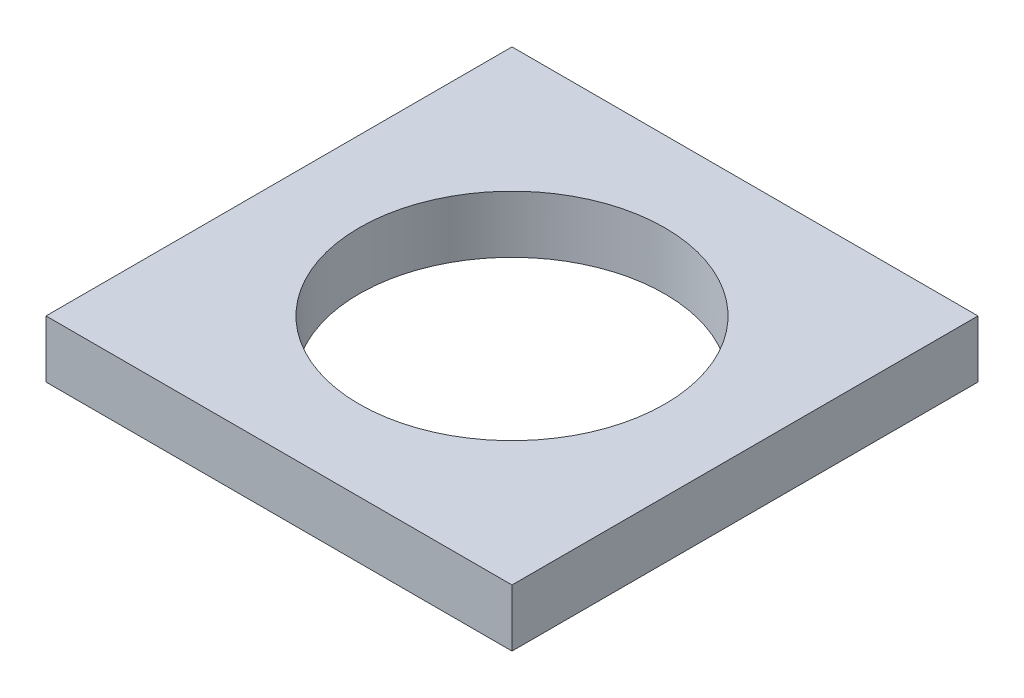
ISO-10303-21;
HEADER;
FILE_DESCRIPTION(('STEP AP214'),'2;1');
FILE_NAME('part.step','',(''),(''),'','','');
FILE_SCHEMA(('AUTOMOTIVE_DESIGN { 1 0 10303 214 1 1 1 1 }'));
ENDSEC;
DATA;
#1=APPLICATION_CONTEXT('core data for automotive mechanical design processes');
#2=APPLICATION_PROTOCOL_DEFINITION('international standard','automotive_design',2000,#1);
#3=PRODUCT_CONTEXT('',#1,'mechanical');
#4=PRODUCT('Part','Part','',(#3));
#5=PRODUCT_RELATED_PRODUCT_CATEGORY('part','',(#4));
#6=PRODUCT_DEFINITION_FORMATION('','',#4);
#7=PRODUCT_DEFINITION_CONTEXT('part definition',#1,'design');
#8=PRODUCT_DEFINITION('design','',#6,#7);
#9=PRODUCT_DEFINITION_SHAPE('','',#8);
#10=(LENGTH_UNIT() NAMED_UNIT(*) SI_UNIT(.MILLI.,.METRE.));
#11=(NAMED_UNIT(*) PLANE_ANGLE_UNIT() SI_UNIT($,.RADIAN.));
#12=(NAMED_UNIT(*) SI_UNIT($,.STERADIAN.) SOLID_ANGLE_UNIT());
#13=UNCERTAINTY_MEASURE_WITH_UNIT(LENGTH_MEASURE(1.E-05),#10,'distance_accuracy_value','');
#14=(GEOMETRIC_REPRESENTATION_CONTEXT(3) GLOBAL_UNCERTAINTY_ASSIGNED_CONTEXT((#13)) GLOBAL_UNIT_ASSIGNED_CONTEXT((#10,
#11,#12)) REPRESENTATION_CONTEXT('',''));
#15=CARTESIAN_POINT('',(0.,0.,0.));
#16=DIRECTION('',(0.,0.,1.));
#17=DIRECTION('',(1.,0.,0.));
#18=AXIS2_PLACEMENT_3D('',#15,#16,#17);
#19=CARTESIAN_POINT('',(-6.1,1.5,-6.1));
#20=DIRECTION('',(1.,0.,0.));
#21=DIRECTION('',(0.,0.,-1.));
#22=AXIS2_PLACEMENT_3D('',#19,#20,#21);
#23=PLANE('',#22);
#24=DIRECTION('',(0.,0.,1.));
#25=VECTOR('',#24,1.);
#26=CARTESIAN_POINT('',(-6.1,0.,-6.1));
#27=LINE('',#26,#25);
#28=CARTESIAN_POINT('',(-6.1,0.,-6.1));
#29=VERTEX_POINT('',#28);
#30=CARTESIAN_POINT('',(-6.1,0.,6.1));
#31=VERTEX_POINT('',#30);
#32=EDGE_CURVE('E112',#29,#31,#27,.T.);
#33=ORIENTED_EDGE('',*,*,#32,.T.);
#34=DIRECTION('',(0.,-1.,0.));
#35=VECTOR('',#34,1.);
#36=CARTESIAN_POINT('',(-6.1,1.5,6.1));
#37=LINE('',#36,#35);
#38=CARTESIAN_POINT('',(-6.1,1.5,6.1));
#39=VERTEX_POINT('',#38);
#40=EDGE_CURVE('E11',#39,#31,#37,.T.);
#41=ORIENTED_EDGE('',*,*,#40,.F.);
#42=DIRECTION('',(0.,0.,1.));
#43=VECTOR('',#42,1.);
#44=CARTESIAN_POINT('',(-6.1,1.5,-6.1));
#45=LINE('',#44,#43);
#46=CARTESIAN_POINT('',(-6.1,1.5,-6.1));
#47=VERTEX_POINT('',#46);
#48=EDGE_CURVE('E98',#47,#39,#45,.T.);
#49=ORIENTED_EDGE('',*,*,#48,.F.);
#50=DIRECTION('',(0.,-1.,0.));
#51=VECTOR('',#50,1.);
#52=CARTESIAN_POINT('',(-6.1,1.5,-6.1));
#53=LINE('',#52,#51);
#54=EDGE_CURVE('E110',#47,#29,#53,.T.);
#55=ORIENTED_EDGE('',*,*,#54,.T.);
#56=EDGE_LOOP('',(#33,#41,#49,#55));
#57=FACE_BOUND('',#56,.T.);
#58=ADVANCED_FACE('F43',(#57),#23,.F.);
#59=CARTESIAN_POINT('',(-6.1,1.5,6.1));
#60=DIRECTION('',(0.,0.,-1.));
#61=DIRECTION('',(-1.,0.,0.));
#62=AXIS2_PLACEMENT_3D('',#59,#60,#61);
#63=PLANE('',#62);
#64=DIRECTION('',(1.,0.,0.));
#65=VECTOR('',#64,1.);
#66=CARTESIAN_POINT('',(-6.1,0.,6.1));
#67=LINE('',#66,#65);
#68=CARTESIAN_POINT('',(6.1,0.,6.1));
#69=VERTEX_POINT('',#68);
#70=EDGE_CURVE('E105',#31,#69,#67,.T.);
#71=ORIENTED_EDGE('',*,*,#70,.T.);
#72=DIRECTION('',(0.,-1.,0.));
#73=VECTOR('',#72,1.);
#74=CARTESIAN_POINT('',(6.1,1.5,6.1));
#75=LINE('',#74,#73);
#76=CARTESIAN_POINT('',(6.1,1.5,6.1));
#77=VERTEX_POINT('',#76);
#78=EDGE_CURVE('E53',#77,#69,#75,.T.);
#79=ORIENTED_EDGE('',*,*,#78,.F.);
#80=DIRECTION('',(1.,0.,0.));
#81=VECTOR('',#80,1.);
#82=CARTESIAN_POINT('',(-6.1,1.5,6.1));
#83=LINE('',#82,#81);
#84=EDGE_CURVE('E91',#39,#77,#83,.T.);
#85=ORIENTED_EDGE('',*,*,#84,.F.);
#86=ORIENTED_EDGE('',*,*,#40,.T.);
#87=EDGE_LOOP('',(#71,#79,#85,#86));
#88=FACE_BOUND('',#87,.T.);
#89=ADVANCED_FACE('F101',(#88),#63,.F.);
#90=CARTESIAN_POINT('',(6.1,1.5,6.1));
#91=DIRECTION('',(-1.,0.,0.));
#92=DIRECTION('',(0.,0.,1.));
#93=AXIS2_PLACEMENT_3D('',#90,#91,#92);
#94=PLANE('',#93);
#95=DIRECTION('',(0.,0.,-1.));
#96=VECTOR('',#95,1.);
#97=CARTESIAN_POINT('',(6.1,0.,6.1));
#98=LINE('',#97,#96);
#99=CARTESIAN_POINT('',(6.1,0.,-6.1));
#100=VERTEX_POINT('',#99);
#101=EDGE_CURVE('E77',#69,#100,#98,.T.);
#102=ORIENTED_EDGE('',*,*,#101,.T.);
#103=DIRECTION('',(0.,-1.,0.));
#104=VECTOR('',#103,1.);
#105=CARTESIAN_POINT('',(6.1,1.5,-6.1));
#106=LINE('',#105,#104);
#107=CARTESIAN_POINT('',(6.1,1.5,-6.1));
#108=VERTEX_POINT('',#107);
#109=EDGE_CURVE('E103',#108,#100,#106,.T.);
#110=ORIENTED_EDGE('',*,*,#109,.F.);
#111=DIRECTION('',(0.,0.,-1.));
#112=VECTOR('',#111,1.);
#113=CARTESIAN_POINT('',(6.1,1.5,6.1));
#114=LINE('',#113,#112);
#115=EDGE_CURVE('E96',#77,#108,#114,.T.);
#116=ORIENTED_EDGE('',*,*,#115,.F.);
#117=ORIENTED_EDGE('',*,*,#78,.T.);
#118=EDGE_LOOP('',(#102,#110,#116,#117));
#119=FACE_BOUND('',#118,.T.);
#120=ADVANCED_FACE('F104',(#119),#94,.F.);
#121=CARTESIAN_POINT('',(6.1,1.5,-6.1));
#122=DIRECTION('',(0.,0.,1.));
#123=DIRECTION('',(1.,0.,0.));
#124=AXIS2_PLACEMENT_3D('',#121,#122,#123);
#125=PLANE('',#124);
#126=DIRECTION('',(-1.,0.,0.));
#127=VECTOR('',#126,1.);
#128=CARTESIAN_POINT('',(6.1,0.,-6.1));
#129=LINE('',#128,#127);
#130=EDGE_CURVE('E88',#100,#29,#129,.T.);
#131=ORIENTED_EDGE('',*,*,#130,.T.);
#132=ORIENTED_EDGE('',*,*,#54,.F.);
#133=DIRECTION('',(-1.,0.,0.));
#134=VECTOR('',#133,1.);
#135=CARTESIAN_POINT('',(6.1,1.5,-6.1));
#136=LINE('',#135,#134);
#137=EDGE_CURVE('E65',#108,#47,#136,.T.);
#138=ORIENTED_EDGE('',*,*,#137,.F.);
#139=ORIENTED_EDGE('',*,*,#109,.T.);
#140=EDGE_LOOP('',(#131,#132,#138,#139));
#141=FACE_BOUND('',#140,.T.);
#142=ADVANCED_FACE('F144',(#141),#125,.F.);
#143=CARTESIAN_POINT('',(0.,1.5,0.));
#144=DIRECTION('',(0.,1.,0.));
#145=DIRECTION('',(0.,0.,1.));
#146=AXIS2_PLACEMENT_3D('',#143,#144,#145);
#147=PLANE('',#146);
#148=CARTESIAN_POINT('',(0.,1.5,0.));
#149=DIRECTION('',(0.,1.,0.));
#150=DIRECTION('',(0.,0.,1.));
#151=AXIS2_PLACEMENT_3D('',#148,#149,#150);
#152=CIRCLE('',#151,4.);
#153=CARTESIAN_POINT('',(0.,1.5,4.));
#154=VERTEX_POINT('',#153);
#155=EDGE_CURVE('E111',#154,#154,#152,.T.);
#156=ORIENTED_EDGE('',*,*,#155,.F.);
#157=EDGE_LOOP('',(#156));
#158=FACE_BOUND('',#157,.T.);
#159=ORIENTED_EDGE('',*,*,#48,.T.);
#160=ORIENTED_EDGE('',*,*,#84,.T.);
#161=ORIENTED_EDGE('',*,*,#115,.T.);
#162=ORIENTED_EDGE('',*,*,#137,.T.);
#163=EDGE_LOOP('',(#159,#160,#161,#162));
#164=FACE_BOUND('',#163,.T.);
#165=ADVANCED_FACE('F94',(#158,#164),#147,.T.);
#166=CARTESIAN_POINT('',(0.,0.,0.));
#167=DIRECTION('',(0.,1.,0.));
#168=DIRECTION('',(0.,0.,1.));
#169=AXIS2_PLACEMENT_3D('',#166,#167,#168);
#170=PLANE('',#169);
#171=CARTESIAN_POINT('',(0.,0.,4.));
#172=CARTESIAN_POINT('',(0.0659925343834726,0.,4.00000509586475));
#173=CARTESIAN_POINT('',(0.131988452159786,0.,3.99842816493858));
#174=CARTESIAN_POINT('',(0.263353398737505,0.,3.99207952934172));
#175=CARTESIAN_POINT('',(0.328723538400925,0.,3.98733072267503));
#176=CARTESIAN_POINT('',(0.458837768815325,0.,3.97463955189117));
#177=CARTESIAN_POINT('',(0.523583358477769,0.,3.96671261418373));
#178=CARTESIAN_POINT('',(0.652447717632859,0.,3.94767450085203));
#179=CARTESIAN_POINT('',(0.716567610829343,0.,3.93657093464054));
#180=CARTESIAN_POINT('',(0.844181220168072,0.,3.9111870424612));
#181=CARTESIAN_POINT('',(0.907674882162577,0.,3.89690644425963));
#182=CARTESIAN_POINT('',(1.03403733720691,0.,3.86517666064671));
#183=CARTESIAN_POINT('',(1.0969041221607,0.,3.84771948228323));
#184=CARTESIAN_POINT('',(1.22201486162074,0.,3.80964371500562));
#185=CARTESIAN_POINT('',(1.2842541470103,0.,3.78900979536685));
#186=CARTESIAN_POINT('',(1.40811292273253,0.,3.74458958181762));
#187=CARTESIAN_POINT('',(1.46972448739009,0.,3.72078121806503));
#188=CARTESIAN_POINT('',(1.59169028341053,0.,3.67027685945113));
#189=CARTESIAN_POINT('',(1.6520455546664,0.,3.64358337613031));
#190=CARTESIAN_POINT('',(1.77095776345467,0.,3.58747452705957));
#191=CARTESIAN_POINT('',(1.82952439583702,0.,3.55807973103441));
#192=CARTESIAN_POINT('',(1.94486144620882,0.,3.49657713806267));
#193=CARTESIAN_POINT('',(2.00163903353522,0.,3.46448279167247));
#194=CARTESIAN_POINT('',(2.11340064037654,0.,3.39758788305642));
#195=CARTESIAN_POINT('',(2.16838847323067,0.,3.36279369347205));
#196=CARTESIAN_POINT('',(2.27657410118789,0.,3.29050632988582));
#197=CARTESIAN_POINT('',(2.32977158787189,0.,3.25301269431332));
#198=CARTESIAN_POINT('',(2.43438087791585,0.,3.17533335569106));
#199=CARTESIAN_POINT('',(2.48578759872795,0.,3.13514080982119));
#200=CARTESIAN_POINT('',(2.58681993667358,0.,3.0520694656875));
#201=CARTESIAN_POINT('',(2.63643519410413,0.,3.00917807325115));
#202=CARTESIAN_POINT('',(2.7338911297634,0.,2.92071646041436));
#203=CARTESIAN_POINT('',(2.78171585697427,0.,2.87512868229323));
#204=CARTESIAN_POINT('',(2.87508400042725,0.,2.78177994798311));
#205=CARTESIAN_POINT('',(2.92063000825502,0.,2.73402158412458));
#206=CARTESIAN_POINT('',(3.00901875468205,0.,2.63667815184556));
#207=CARTESIAN_POINT('',(3.05187832329683,0.,2.58710837875942));
#208=CARTESIAN_POINT('',(3.13489980886772,0.,2.48614978245923));
#209=CARTESIAN_POINT('',(3.17507349647622,0.,2.43477064209678));
#210=CARTESIAN_POINT('',(3.2527281926505,0.,2.33019849819104));
#211=CARTESIAN_POINT('',(3.29021516301981,0.,2.27700992293209));
#212=CARTESIAN_POINT('',(3.36250247175753,0.,2.16882425759257));
#213=CARTESIAN_POINT('',(3.39730234854909,0.,2.11382685910387));
#214=CARTESIAN_POINT('',(3.46422213520263,0.,2.00202826647796));
#215=CARTESIAN_POINT('',(3.49633473076606,0.,1.94522269540345));
#216=CARTESIAN_POINT('',(3.55788641264991,0.,1.82981137879405));
#217=CARTESIAN_POINT('',(3.58731110827304,0.,1.77119796224902));
#218=CARTESIAN_POINT('',(3.64349585896112,0.,1.65217531681726));
#219=CARTESIAN_POINT('',(3.67023445815781,0.,1.59175597090144));
#220=CARTESIAN_POINT('',(3.72077236081809,0.,1.46978254426454));
#221=CARTESIAN_POINT('',(3.74457505063653,0.,1.40822986678758));
#222=CARTESIAN_POINT('',(3.78898388558518,0.,1.28447135321845));
#223=CARTESIAN_POINT('',(3.80961143289333,0.,1.22227320760457));
#224=CARTESIAN_POINT('',(3.84767810201121,0.,1.09722867979254));
#225=CARTESIAN_POINT('',(3.86513180395263,0.,1.03438673894914));
#226=CARTESIAN_POINT('',(3.89685736139202,0.,0.908057509852743));
#227=CARTESIAN_POINT('',(3.9111364195093,0.,0.844572031317577));
#228=CARTESIAN_POINT('',(3.93652032276752,0.,0.716958353975039));
#229=CARTESIAN_POINT('',(3.94762462344437,0.,0.652830046873515));
#230=CARTESIAN_POINT('',(3.96666697549395,0.,0.523932521733204));
#231=CARTESIAN_POINT('',(3.97459659435456,0.,0.459162058992501));
#232=CARTESIAN_POINT('',(3.98729693466483,0.,0.328981096865809));
#233=CARTESIAN_POINT('',(3.99205142527532,0.,0.263569017471993));
#234=CARTESIAN_POINT('',(3.99841137199231,0.,0.132105458212461));
#235=CARTESIAN_POINT('',(3.99999313384183,0.,0.0660528422359527));
#236=CARTESIAN_POINT('',(4.00000685816299,0.,-0.065975928198626));
#237=CARTESIAN_POINT('',(3.99844248621683,0.,-0.131952082130075));
#238=CARTESIAN_POINT('',(3.99211056713153,0.,-0.263284565176043));
#239=CARTESIAN_POINT('',(3.98736573604517,0.,-0.328641979474));
#240=CARTESIAN_POINT('',(3.97468228341249,0.,-0.458735542968781));
#241=CARTESIAN_POINT('',(3.96675883178429,0.,-0.523473168463692));
#242=CARTESIAN_POINT('',(3.94772532196141,0.,-0.652327002798371));
#243=CARTESIAN_POINT('',(3.93662261066832,0.,-0.716444295999951));
#244=CARTESIAN_POINT('',(3.91123863928166,0.,-0.844057959790898));
#245=CARTESIAN_POINT('',(3.89695683472648,0.,-0.90755422207363));
#246=CARTESIAN_POINT('',(3.8652227266919,0.,-1.03392719998477));
#247=CARTESIAN_POINT('',(3.84776215626035,0.,-1.09680183858513));
#248=CARTESIAN_POINT('',(3.8096776433137,0.,-1.22193357483878));
#249=CARTESIAN_POINT('',(3.78903810081568,0.,-1.28418592095572));
#250=CARTESIAN_POINT('',(3.74460499932699,0.,-1.40807625886605));
#251=CARTESIAN_POINT('',(3.72078911492648,0.,-1.46970623288936));
#252=CARTESIAN_POINT('',(3.67027657150504,0.,-1.59169016366688));
#253=CARTESIAN_POINT('',(3.643583299242,0.,-1.65204552269214));
#254=CARTESIAN_POINT('',(3.5874746034045,0.,-1.77095779520322));
#255=CARTESIAN_POINT('',(3.55807975144455,0.,-1.82952440432486));
#256=CARTESIAN_POINT('',(3.49657711774884,0.,-1.94486143776146));
#257=CARTESIAN_POINT('',(3.46448278623514,0.,-2.00163903127435));
#258=CARTESIAN_POINT('',(3.39758788848133,0.,-2.1134006426328));
#259=CARTESIAN_POINT('',(3.36279369492592,0.,-2.16838847383557));
#260=CARTESIAN_POINT('',(3.29050632843173,0.,-2.2765741005835));
#261=CARTESIAN_POINT('',(3.25301269392317,0.,-2.32977158770994));
#262=CARTESIAN_POINT('',(3.17533335608228,0.,-2.43438087807881));
#263=CARTESIAN_POINT('',(3.1351408099263,0.,-2.48578759877192));
#264=CARTESIAN_POINT('',(3.05206946558189,0.,-2.58681993662986));
#265=CARTESIAN_POINT('',(3.00917807322276,0.,-2.6364351940925));
#266=CARTESIAN_POINT('',(2.92071646044297,0.,-2.73389112977539));
#267=CARTESIAN_POINT('',(2.87512868230088,0.,-2.78171585697751));
#268=CARTESIAN_POINT('',(2.78177994797538,0.,-2.87508400042411));
#269=CARTESIAN_POINT('',(2.73402158412236,0.,-2.92063000825424));
#270=CARTESIAN_POINT('',(2.63667815184727,0.,-3.00901875468302));
#271=CARTESIAN_POINT('',(2.58710837875959,0.,-3.0518783232972));
#272=CARTESIAN_POINT('',(2.48614978245823,0.,-3.13489980886769));
#273=CARTESIAN_POINT('',(2.43477064209614,0.,-3.17507349647637));
#274=CARTESIAN_POINT('',(2.33019849819064,0.,-3.25272819265079));
#275=CARTESIAN_POINT('',(2.27700992293157,0.,-3.29021516302006));
#276=CARTESIAN_POINT('',(2.16882425759198,0.,-3.36250247175774));
#277=CARTESIAN_POINT('',(2.11382685910332,0.,-3.39730234854931));
#278=CARTESIAN_POINT('',(2.00202826647748,0.,-3.46422213520284));
#279=CARTESIAN_POINT('',(1.94522269540299,0.,-3.49633473076626));
#280=CARTESIAN_POINT('',(1.82981137879368,0.,-3.55788641265006));
#281=CARTESIAN_POINT('',(1.77119796224871,0.,-3.58731110827316));
#282=CARTESIAN_POINT('',(1.6521753168171,0.,-3.64349585896119));
#283=CARTESIAN_POINT('',(1.59175597090136,0.,-3.67023445815784));
#284=CARTESIAN_POINT('',(1.46978254426454,0.,-3.7207723608181));
#285=CARTESIAN_POINT('',(1.40822986678758,0.,-3.74457505063654));
#286=CARTESIAN_POINT('',(1.28447135321845,0.,-3.78898388558518));
#287=CARTESIAN_POINT('',(1.22227320760457,0.,-3.80961143289333));
#288=CARTESIAN_POINT('',(1.09722867979254,0.,-3.84767810201121));
#289=CARTESIAN_POINT('',(1.03438673894914,0.,-3.86513180395263));
#290=CARTESIAN_POINT('',(0.908057509852743,0.,-3.89685736139203));
#291=CARTESIAN_POINT('',(0.844572031317577,0.,-3.9111364195093));
#292=CARTESIAN_POINT('',(0.716958353975039,0.,-3.93652032276752));
#293=CARTESIAN_POINT('',(0.652830046873515,0.,-3.94762462344437));
#294=CARTESIAN_POINT('',(0.523932521733204,0.,-3.96666697549395));
#295=CARTESIAN_POINT('',(0.459162058992501,0.,-3.97459659435456));
#296=CARTESIAN_POINT('',(0.328981096865809,0.,-3.98729693466483));
#297=CARTESIAN_POINT('',(0.263569017471993,0.,-3.99205142527532));
#298=CARTESIAN_POINT('',(0.132105458212461,0.,-3.99841137199231));
#299=CARTESIAN_POINT('',(0.0660528422359526,0.,-3.99999313384183));
#300=CARTESIAN_POINT('',(-0.0659759281986836,0.,-4.00000685816299));
#301=CARTESIAN_POINT('',(-0.13195208213019,0.,-3.99844248621683));
#302=CARTESIAN_POINT('',(-0.263284565176257,0.,-3.99211056713153));
#303=CARTESIAN_POINT('',(-0.328641979474256,0.,-3.98736573604517));
#304=CARTESIAN_POINT('',(-0.458735542969102,0.,-3.97468228341249));
#305=CARTESIAN_POINT('',(-0.523473168464038,0.,-3.96675883178429));
#306=CARTESIAN_POINT('',(-0.652327002798749,0.,-3.94772532196141));
#307=CARTESIAN_POINT('',(-0.716444296000338,0.,-3.93662261066833));
#308=CARTESIAN_POINT('',(-0.844057959791285,0.,-3.91123863928167));
#309=CARTESIAN_POINT('',(-0.907554222074009,0.,-3.89695683472649));
#310=CARTESIAN_POINT('',(-1.03392719998512,0.,-3.8652227266919));
#311=CARTESIAN_POINT('',(-1.09680183858545,0.,-3.84776215626035));
#312=CARTESIAN_POINT('',(-1.22193357483904,0.,-3.8096776433137));
#313=CARTESIAN_POINT('',(-1.28418592095594,0.,-3.78903810081568));
#314=CARTESIAN_POINT('',(-1.40807625886617,0.,-3.74460499932699));
#315=CARTESIAN_POINT('',(-1.46970623288942,0.,-3.72078911492648));
#316=CARTESIAN_POINT('',(-1.59169016366688,0.,-3.67027657150502));
#317=CARTESIAN_POINT('',(-1.65204552269214,0.,-3.64358329924195));
#318=CARTESIAN_POINT('',(-1.77095779520322,0.,-3.58747460340441));
#319=CARTESIAN_POINT('',(-1.82952440432486,0.,-3.55807975144444));
#320=CARTESIAN_POINT('',(-1.94486143776146,0.,-3.4965771177487));
#321=CARTESIAN_POINT('',(-2.00163903127435,0.,-3.46448278623499));
#322=CARTESIAN_POINT('',(-2.1134006426328,0.,-3.39758788848117));
#323=CARTESIAN_POINT('',(-2.16838847383557,0.,-3.36279369492576));
#324=CARTESIAN_POINT('',(-2.2765741005835,0.,-3.29050632843157));
#325=CARTESIAN_POINT('',(-2.32977158770994,0.,-3.25301269392301));
#326=CARTESIAN_POINT('',(-2.43438087807881,0.,-3.17533335608214));
#327=CARTESIAN_POINT('',(-2.48578759877191,0.,-3.13514080992616));
#328=CARTESIAN_POINT('',(-2.58681993662985,0.,-3.05206946558178));
#329=CARTESIAN_POINT('',(-2.6364351940925,0.,-3.00917807322267));
#330=CARTESIAN_POINT('',(-2.73389112977539,0.,-2.92071646044293));
#331=CARTESIAN_POINT('',(-2.78171585697751,0.,-2.87512868230086));
#332=CARTESIAN_POINT('',(-2.8750840004241,0.,-2.78177994797541));
#333=CARTESIAN_POINT('',(-2.92063000825423,0.,-2.73402158412242));
#334=CARTESIAN_POINT('',(-3.00901875468301,0.,-2.63667815184738));
#335=CARTESIAN_POINT('',(-3.05187832329718,0.,-2.58710837875972));
#336=CARTESIAN_POINT('',(-3.13489980886767,0.,-2.48614978245839));
#337=CARTESIAN_POINT('',(-3.17507349647634,0.,-2.43477064209631));
#338=CARTESIAN_POINT('',(-3.25272819265076,0.,-2.33019849819083));
#339=CARTESIAN_POINT('',(-3.29021516302003,0.,-2.27700992293176));
#340=CARTESIAN_POINT('',(-3.36250247175772,0.,-2.16882425759217));
#341=CARTESIAN_POINT('',(-3.39730234854928,0.,-2.11382685910351));
#342=CARTESIAN_POINT('',(-3.46422213520282,0.,-2.00202826647765));
#343=CARTESIAN_POINT('',(-3.49633473076623,0.,-1.94522269540315));
#344=CARTESIAN_POINT('',(-3.55788641265004,0.,-1.8298113787938));
#345=CARTESIAN_POINT('',(-3.58731110827315,0.,-1.77119796224882));
#346=CARTESIAN_POINT('',(-3.64349585896118,0.,-1.65217531681716));
#347=CARTESIAN_POINT('',(-3.67023445815784,0.,-1.59175597090138));
#348=CARTESIAN_POINT('',(-3.7207723608181,0.,-1.46978254426452));
#349=CARTESIAN_POINT('',(-3.74457505063654,0.,-1.40822986678754));
#350=CARTESIAN_POINT('',(-3.78898388558518,0.,-1.28447135321839));
#351=CARTESIAN_POINT('',(-3.80961143289333,0.,-1.22227320760449));
#352=CARTESIAN_POINT('',(-3.84767810201121,0.,-1.09722867979244));
#353=CARTESIAN_POINT('',(-3.86513180395263,0.,-1.03438673894903));
#354=CARTESIAN_POINT('',(-3.89685736139202,0.,-0.908057509852623));
#355=CARTESIAN_POINT('',(-3.9111364195093,0.,-0.844572031317454));
#356=CARTESIAN_POINT('',(-3.93652032276752,0.,-0.716958353974916));
#357=CARTESIAN_POINT('',(-3.94762462344437,0.,-0.652830046873395));
#358=CARTESIAN_POINT('',(-3.96666697549395,0.,-0.523932521733095));
#359=CARTESIAN_POINT('',(-3.97459659435456,0.,-0.459162058992399));
#360=CARTESIAN_POINT('',(-3.98729693466483,0.,-0.328981096865729));
#361=CARTESIAN_POINT('',(-3.99205142527532,0.,-0.263569017471925));
#362=CARTESIAN_POINT('',(-3.99841137199231,0.,-0.132105458212425));
#363=CARTESIAN_POINT('',(-3.99999313384183,0.,-0.0660528422359344));
#364=CARTESIAN_POINT('',(-4.00000685816299,0.,0.0659759281986777));
#365=CARTESIAN_POINT('',(-3.99844248621683,0.,0.131952082130179));
#366=CARTESIAN_POINT('',(-3.99211056713153,0.,0.263284565176235));
#367=CARTESIAN_POINT('',(-3.98736573604517,0.,0.328641979474229));
#368=CARTESIAN_POINT('',(-3.97468228341249,0.,0.458735542969069));
#369=CARTESIAN_POINT('',(-3.96675883178429,0.,0.523473168464002));
#370=CARTESIAN_POINT('',(-3.94772532196141,0.,0.65232700279871));
#371=CARTESIAN_POINT('',(-3.93662261066833,0.,0.716444296000298));
#372=CARTESIAN_POINT('',(-3.91123863928167,0.,0.844057959791246));
#373=CARTESIAN_POINT('',(-3.89695683472649,0.,0.90755422207397));
#374=CARTESIAN_POINT('',(-3.8652227266919,0.,1.03392719998509));
#375=CARTESIAN_POINT('',(-3.84776215626035,0.,1.09680183858542));
#376=CARTESIAN_POINT('',(-3.8096776433137,0.,1.22193357483901));
#377=CARTESIAN_POINT('',(-3.78903810081568,0.,1.28418592095591));
#378=CARTESIAN_POINT('',(-3.74460499932699,0.,1.40807625886615));
#379=CARTESIAN_POINT('',(-3.72078911492648,0.,1.46970623288941));
#380=CARTESIAN_POINT('',(-3.67027657150504,0.,1.59169016366684));
#381=CARTESIAN_POINT('',(-3.64358329924199,0.,1.65204552269205));
#382=CARTESIAN_POINT('',(-3.58747460340449,0.,1.77095779520305));
#383=CARTESIAN_POINT('',(-3.55807975144453,0.,1.82952440432466));
#384=CARTESIAN_POINT('',(-3.49657711774882,0.,1.94486143776121));
#385=CARTESIAN_POINT('',(-3.46448278623512,0.,2.00163903127409));
#386=CARTESIAN_POINT('',(-3.39758788848131,0.,2.11340064263249));
#387=CARTESIAN_POINT('',(-3.36279369492589,0.,2.16838847383523));
#388=CARTESIAN_POINT('',(-3.29050632843173,0.,2.27657410058323));
#389=CARTESIAN_POINT('',(-3.25301269392321,0.,2.32977158770978));
#390=CARTESIAN_POINT('',(-3.1753333560822,0.,2.43438087807839));
#391=CARTESIAN_POINT('',(-3.13514080992605,0.,2.48578759877112));
#392=CARTESIAN_POINT('',(-3.0520694655821,0.,2.5868199366302));
#393=CARTESIAN_POINT('',(-3.0091780732236,0.,2.63643519409436));
#394=CARTESIAN_POINT('',(-2.92071646044212,0.,2.73389112977325));
#395=CARTESIAN_POINT('',(-2.87512868229768,0.,2.78171585696978));
#396=CARTESIAN_POINT('',(-2.78177994797866,0.,2.87508400043175));
#397=CARTESIAN_POINT('',(-2.73402158413445,0.,2.92063000828279));
#398=CARTESIAN_POINT('',(-2.63667815183572,0.,3.0090187546545));
#399=CARTESIAN_POINT('',(-2.58710837871588,0.,3.05187832319138));
#400=CARTESIAN_POINT('',(-2.48614978250252,0.,3.13489980897272));
#401=CARTESIAN_POINT('',(-2.43477064225989,0.,3.17507349686782));
#402=CARTESIAN_POINT('',(-2.33019849802825,0.,3.25272819225987));
#403=CARTESIAN_POINT('',(-2.27700992232489,0.,3.29021516156345));
#404=CARTESIAN_POINT('',(-2.16882425819982,0.,3.36250247321421));
#405=CARTESIAN_POINT('',(-2.11382686137034,0.,3.3973023539854));
#406=CARTESIAN_POINT('',(-2.00202826420546,0.,3.46422212975203));
#407=CARTESIAN_POINT('',(-1.94522268691201,0.,3.49633471039915));
#408=CARTESIAN_POINT('',(-1.82981138732852,0.,3.5578864331202));
#409=CARTESIAN_POINT('',(-1.77119799417799,0.,3.58731118485576));
#410=CARTESIAN_POINT('',(-1.65217528465069,0.,3.6434957818086));
#411=CARTESIAN_POINT('',(-1.59175585041847,0.,3.67023416917557));
#412=CARTESIAN_POINT('',(-1.46976427929401,0.,3.72078026725116));
#413=CARTESIAN_POINT('',(-1.40819318236193,0.,3.74459048763114));
#414=CARTESIAN_POINT('',(-1.28440308757743,0.,3.78901222967328));
#415=CARTESIAN_POINT('',(-1.22219187274271,0.,3.80964541013703));
#416=CARTESIAN_POINT('',(-1.09712633890743,0.,3.84772082907812));
#417=CARTESIAN_POINT('',(-1.03427654380022,0.,3.86517791748699));
#418=CARTESIAN_POINT('',(-0.907936774959298,0.,3.89690783264057));
#419=CARTESIAN_POINT('',(-0.844448679993867,0.,3.91118813619404));
#420=CARTESIAN_POINT('',(-0.716834988036237,0.,3.93657201605868));
#421=CARTESIAN_POINT('',(-0.652709336897265,0.,3.94767532012528));
#422=CARTESIAN_POINT('',(-0.523822193471628,0.,3.96671344636426));
#423=CARTESIAN_POINT('',(-0.459059495152028,0.,3.97464009982227));
#424=CARTESIAN_POINT('',(-0.328899771249172,0.,3.98733127271523));
#425=CARTESIAN_POINT('',(-0.263501193010413,0.,3.99207980514602));
#426=CARTESIAN_POINT('',(-0.132068010966088,0.,3.99842842901139));
#427=CARTESIAN_POINT('',(-0.0660322702165955,0.,4.00000507504896));
#428=CARTESIAN_POINT('',(0.,0.,4.));
#429=B_SPLINE_CURVE_WITH_KNOTS('',3,(#171,#172,#173,#174,#175,#176,#177,#178,#179,#180,#181,
#182,#183,#184,#185,#186,#187,#188,#189,#190,#191,#192,#193,#194,#195,#196,#197,#198,#199,#200,
#201,#202,#203,#204,#205,#206,#207,#208,#209,#210,#211,#212,#213,#214,#215,#216,#217,#218,#219,
#220,#221,#222,#223,#224,#225,#226,#227,#228,#229,#230,#231,#232,#233,#234,#235,#236,#237,#238,
#239,#240,#241,#242,#243,#244,#245,#246,#247,#248,#249,#250,#251,#252,#253,#254,#255,#256,#257,
#258,#259,#260,#261,#262,#263,#264,#265,#266,#267,#268,#269,#270,#271,#272,#273,#274,#275,#276,
#277,#278,#279,#280,#281,#282,#283,#284,#285,#286,#287,#288,#289,#290,#291,#292,#293,#294,#295,
#296,#297,#298,#299,#300,#301,#302,#303,#304,#305,#306,#307,#308,#309,#310,#311,#312,#313,#314,
#315,#316,#317,#318,#319,#320,#321,#322,#323,#324,#325,#326,#327,#328,#329,#330,#331,#332,#333,
#334,#335,#336,#337,#338,#339,#340,#341,#342,#343,#344,#345,#346,#347,#348,#349,#350,#351,#352,
#353,#354,#355,#356,#357,#358,#359,#360,#361,#362,#363,#364,#365,#366,#367,#368,#369,#370,#371,
#372,#373,#374,#375,#376,#377,#378,#379,#380,#381,#382,#383,#384,#385,#386,#387,#388,#389,#390,
#391,#392,#393,#394,#395,#396,#397,#398,#399,#400,#401,#402,#403,#404,#405,#406,#407,#408,#409,
#410,#411,#412,#413,#414,#415,#416,#417,#418,#419,#420,#421,#422,#423,#424,#425,#426,#427,#428),
.UNSPECIFIED.,.F.,.F.,(4,2,2,2,2,2,2,2,2,2,2,2,2,2,2,2,2,2,2,2,2,2,2,2,2,2,2,2,2,2,2,2,2,2,2,2,
2,2,2,2,2,2,2,2,2,2,2,2,2,2,2,2,2,2,2,2,2,2,2,2,2,2,2,2,2,2,2,2,2,2,2,2,2,2,2,2,2,2,2,2,2,2,2,2,
2,2,2,2,2,2,2,2,2,2,2,2,2,2,2,2,2,2,2,2,2,2,2,2,2,2,2,2,2,2,2,2,2,2,2,2,2,2,2,2,2,2,2,2,4),(0.,
0.197963498796379,0.394513111914489,0.59012001981385,0.785262231697681,0.98042117138473,
1.17607813921498,1.37271077847199,1.57078967442439,1.76869750769342,1.96520665972397,
2.16078892446554,2.35592281905657,2.55109015864554,2.74677251133314,2.9434476621571,
3.14158621427922,3.3394940475482,3.53600319957871,3.73158546432026,3.92671935891128,
4.12188669850026,4.3175690511879,4.51424420201192,4.71238275413412,4.91029058740327,
5.1067997394339,5.30238200417552,5.49751589876657,5.69268323835553,5.88836559104309,
6.08504074186697,6.28317929398898,6.48108712725805,6.67759627928863,6.87317854403021,
7.06831243862125,7.26347977821021,7.45916213089781,7.65583728172175,7.85397583384384,
8.05188366711299,8.24839281914363,8.44397508388525,8.6391089784763,8.83427631806525,
9.02995867075282,9.22663382157671,9.42477237369873,9.62268020696796,9.81918935899865,
10.0147716237403,10.2099055183314,10.4050728579203,10.6007552106078,10.7974303614317,
10.9955689135536,11.1934767468227,11.3899858988534,11.585568163595,11.780702058186,
11.975869397775,12.1715517504626,12.3682269012864,12.5663654534085,12.7642732866777,
12.9607824387084,13.1563647034501,13.3514985980411,13.5466659376301,13.7423482903176,
13.9390234411414,14.1371619932633,14.3350698265325,14.5315789785632,14.7271612433048,
14.9222951378959,15.1174624774848,15.3131448301724,15.5098199809962,15.7079585331182,
15.9058663663873,16.102375518418,16.2979577831596,16.4930916777507,16.6882590173396,
16.8839413700272,17.0806165208511,17.2787550729731,17.4766629062423,17.673172058273,
17.8687543230146,18.0638882176057,18.2590555571946,18.4547379098821,18.651413060706,
18.8495516128279,19.0474594460972,19.2439685981278,19.4395508628695,19.6346847574605,
19.8298520970495,20.025534449737,20.2222096005609,20.4203481526828,20.6182559859518,
20.8147651379824,21.010347402724,21.205481297315,21.400648636904,21.5963309895916,
21.7930061404155,21.9911446925376,22.1890525258066,22.3855616778372,22.5811439425787,
22.7762778371698,22.9714451767587,23.1671275294464,23.3638026802704,23.5619412323925,
23.7599087626909,23.95646045502,24.1520681213889,24.3472104212806,24.5423694383709,
24.7380271327664,24.9346617977686,25.1327446497896),.UNSPECIFIED.);
#430=CARTESIAN_POINT('',(0.,0.,4.));
#431=VERTEX_POINT('',#430);
#432=EDGE_CURVE('E125',#431,#431,#429,.T.);
#433=ORIENTED_EDGE('',*,*,#432,.T.);
#434=EDGE_LOOP('',(#433));
#435=FACE_BOUND('',#434,.T.);
#436=ORIENTED_EDGE('',*,*,#32,.F.);
#437=ORIENTED_EDGE('',*,*,#130,.F.);
#438=ORIENTED_EDGE('',*,*,#101,.F.);
#439=ORIENTED_EDGE('',*,*,#70,.F.);
#440=EDGE_LOOP('',(#436,#437,#438,#439));
#441=FACE_BOUND('',#440,.T.);
#442=ADVANCED_FACE('F123',(#435,#441),#170,.F.);
#443=CARTESIAN_POINT('',(0.,1.5,0.));
#444=DIRECTION('',(0.,-1.,0.));
#445=DIRECTION('',(0.,0.,-1.));
#446=AXIS2_PLACEMENT_3D('',#443,#444,#445);
#447=CYLINDRICAL_SURFACE('',#446,4.);
#448=ORIENTED_EDGE('',*,*,#155,.T.);
#449=EDGE_LOOP('',(#448));
#450=FACE_BOUND('',#449,.T.);
#451=ORIENTED_EDGE('',*,*,#432,.F.);
#452=EDGE_LOOP('',(#451));
#453=FACE_BOUND('',#452,.T.);
#454=ADVANCED_FACE('F132',(#450,#453),#447,.F.);
#455=CLOSED_SHELL('',(#58,#89,#120,#142,#165,#442,#454));
#456=MANIFOLD_SOLID_BREP('B2',#455);
#457=ADVANCED_BREP_SHAPE_REPRESENTATION('',(#18,#456),#14);
#458=SHAPE_DEFINITION_REPRESENTATION(#9,#457);
ENDSEC;
END-ISO-10303-21;
